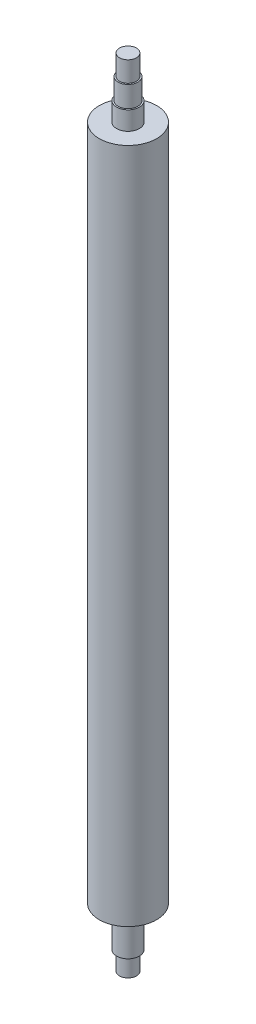
ISO-10303-21;
HEADER;
FILE_DESCRIPTION(('STEP AP214'),'2;1');
FILE_NAME('part.step','',(''),(''),'','','');
FILE_SCHEMA(('AUTOMOTIVE_DESIGN { 1 0 10303 214 1 1 1 1 }'));
ENDSEC;
DATA;
#1=APPLICATION_CONTEXT('core data for automotive mechanical design processes');
#2=APPLICATION_PROTOCOL_DEFINITION('international standard','automotive_design',2000,#1);
#3=PRODUCT_CONTEXT('',#1,'mechanical');
#4=PRODUCT('Part','Part','',(#3));
#5=PRODUCT_RELATED_PRODUCT_CATEGORY('part','',(#4));
#6=PRODUCT_DEFINITION_FORMATION('','',#4);
#7=PRODUCT_DEFINITION_CONTEXT('part definition',#1,'design');
#8=PRODUCT_DEFINITION('design','',#6,#7);
#9=PRODUCT_DEFINITION_SHAPE('','',#8);
#10=(LENGTH_UNIT() NAMED_UNIT(*) SI_UNIT(.MILLI.,.METRE.));
#11=(NAMED_UNIT(*) PLANE_ANGLE_UNIT() SI_UNIT($,.RADIAN.));
#12=(NAMED_UNIT(*) SI_UNIT($,.STERADIAN.) SOLID_ANGLE_UNIT());
#13=UNCERTAINTY_MEASURE_WITH_UNIT(LENGTH_MEASURE(1.E-05),#10,'distance_accuracy_value','');
#14=(GEOMETRIC_REPRESENTATION_CONTEXT(3) GLOBAL_UNCERTAINTY_ASSIGNED_CONTEXT((#13)) GLOBAL_UNIT_ASSIGNED_CONTEXT((#10,
#11,#12)) REPRESENTATION_CONTEXT('',''));
#15=CARTESIAN_POINT('',(0.,0.,0.));
#16=DIRECTION('',(0.,0.,1.));
#17=DIRECTION('',(1.,0.,0.));
#18=AXIS2_PLACEMENT_3D('',#15,#16,#17);
#19=CARTESIAN_POINT('',(0.,236.,0.));
#20=DIRECTION('',(0.,-1.,0.));
#21=DIRECTION('',(0.,0.,-1.));
#22=AXIS2_PLACEMENT_3D('',#19,#20,#21);
#23=CYLINDRICAL_SURFACE('',#22,10.);
#24=CARTESIAN_POINT('',(0.,236.,0.));
#25=DIRECTION('',(0.,1.,0.));
#26=DIRECTION('',(0.,0.,1.));
#27=AXIS2_PLACEMENT_3D('',#24,#25,#26);
#28=CIRCLE('',#27,10.);
#29=CARTESIAN_POINT('',(0.,236.,10.));
#30=VERTEX_POINT('',#29);
#31=EDGE_CURVE('E57',#30,#30,#28,.T.);
#32=ORIENTED_EDGE('',*,*,#31,.F.);
#33=EDGE_LOOP('',(#32));
#34=FACE_BOUND('',#33,.T.);
#35=CARTESIAN_POINT('',(0.,0.,0.));
#36=DIRECTION('',(0.,1.,0.));
#37=DIRECTION('',(0.,0.,1.));
#38=AXIS2_PLACEMENT_3D('',#35,#36,#37);
#39=CIRCLE('',#38,10.);
#40=CARTESIAN_POINT('',(0.,0.,10.));
#41=VERTEX_POINT('',#40);
#42=EDGE_CURVE('E34',#41,#41,#39,.T.);
#43=ORIENTED_EDGE('',*,*,#42,.T.);
#44=EDGE_LOOP('',(#43));
#45=FACE_BOUND('',#44,.T.);
#46=ADVANCED_FACE('F31',(#34,#45),#23,.T.);
#47=CARTESIAN_POINT('',(0.,236.,0.));
#48=DIRECTION('',(0.,1.,0.));
#49=DIRECTION('',(0.,0.,1.));
#50=AXIS2_PLACEMENT_3D('',#47,#48,#49);
#51=PLANE('',#50);
#52=CARTESIAN_POINT('',(0.,236.,0.));
#53=DIRECTION('',(0.,1.,0.));
#54=DIRECTION('',(0.,0.,1.));
#55=AXIS2_PLACEMENT_3D('',#52,#53,#54);
#56=CIRCLE('',#55,3.965);
#57=CARTESIAN_POINT('',(0.,236.,-3.965));
#58=VERTEX_POINT('',#57);
#59=EDGE_CURVE('E43',#58,#58,#56,.T.);
#60=ORIENTED_EDGE('',*,*,#59,.F.);
#61=EDGE_LOOP('',(#60));
#62=FACE_BOUND('',#61,.T.);
#63=ORIENTED_EDGE('',*,*,#31,.T.);
#64=EDGE_LOOP('',(#63));
#65=FACE_BOUND('',#64,.T.);
#66=ADVANCED_FACE('F78',(#62,#65),#51,.T.);
#67=CARTESIAN_POINT('',(0.,0.,0.));
#68=DIRECTION('',(0.,1.,0.));
#69=DIRECTION('',(0.,0.,1.));
#70=AXIS2_PLACEMENT_3D('',#67,#68,#69);
#71=PLANE('',#70);
#72=CARTESIAN_POINT('',(0.,0.,0.));
#73=DIRECTION('',(0.,1.,0.));
#74=DIRECTION('',(0.,0.,1.));
#75=AXIS2_PLACEMENT_3D('',#72,#73,#74);
#76=CIRCLE('',#75,3.965);
#77=CARTESIAN_POINT('',(0.,0.,3.965));
#78=VERTEX_POINT('',#77);
#79=EDGE_CURVE('E61',#78,#78,#76,.T.);
#80=ORIENTED_EDGE('',*,*,#79,.T.);
#81=EDGE_LOOP('',(#80));
#82=FACE_BOUND('',#81,.T.);
#83=ORIENTED_EDGE('',*,*,#42,.F.);
#84=EDGE_LOOP('',(#83));
#85=FACE_BOUND('',#84,.T.);
#86=ADVANCED_FACE('F75',(#82,#85),#71,.F.);
#87=CARTESIAN_POINT('',(0.,-14.,0.));
#88=DIRECTION('',(0.,1.,0.));
#89=DIRECTION('',(0.,0.,1.));
#90=AXIS2_PLACEMENT_3D('',#87,#88,#89);
#91=CYLINDRICAL_SURFACE('',#90,3.965);
#92=CARTESIAN_POINT('',(0.,-14.,0.));
#93=DIRECTION('',(0.,1.,0.));
#94=DIRECTION('',(0.,0.,1.));
#95=AXIS2_PLACEMENT_3D('',#92,#93,#94);
#96=CIRCLE('',#95,3.965);
#97=CARTESIAN_POINT('',(0.,-14.,3.965));
#98=VERTEX_POINT('',#97);
#99=EDGE_CURVE('E64',#98,#98,#96,.T.);
#100=ORIENTED_EDGE('',*,*,#99,.T.);
#101=EDGE_LOOP('',(#100));
#102=FACE_BOUND('',#101,.T.);
#103=ORIENTED_EDGE('',*,*,#79,.F.);
#104=EDGE_LOOP('',(#103));
#105=FACE_BOUND('',#104,.T.);
#106=ADVANCED_FACE('F77',(#102,#105),#91,.T.);
#107=CARTESIAN_POINT('',(0.,-14.,0.));
#108=DIRECTION('',(0.,1.,0.));
#109=DIRECTION('',(0.,0.,1.));
#110=AXIS2_PLACEMENT_3D('',#107,#108,#109);
#111=PLANE('',#110);
#112=CARTESIAN_POINT('',(0.,-14.,0.));
#113=DIRECTION('',(0.,1.,0.));
#114=DIRECTION('',(0.,0.,1.));
#115=AXIS2_PLACEMENT_3D('',#112,#113,#114);
#116=CIRCLE('',#115,2.95);
#117=CARTESIAN_POINT('',(0.,-14.,2.95));
#118=VERTEX_POINT('',#117);
#119=EDGE_CURVE('E54',#118,#118,#116,.T.);
#120=ORIENTED_EDGE('',*,*,#119,.T.);
#121=EDGE_LOOP('',(#120));
#122=FACE_BOUND('',#121,.T.);
#123=ORIENTED_EDGE('',*,*,#99,.F.);
#124=EDGE_LOOP('',(#123));
#125=FACE_BOUND('',#124,.T.);
#126=ADVANCED_FACE('F84',(#122,#125),#111,.F.);
#127=CARTESIAN_POINT('',(0.,-20.5,0.));
#128=DIRECTION('',(0.,1.,0.));
#129=DIRECTION('',(0.,0.,1.));
#130=AXIS2_PLACEMENT_3D('',#127,#128,#129);
#131=CYLINDRICAL_SURFACE('',#130,2.95);
#132=CARTESIAN_POINT('',(0.,-20.5,0.));
#133=DIRECTION('',(0.,1.,0.));
#134=DIRECTION('',(0.,0.,1.));
#135=AXIS2_PLACEMENT_3D('',#132,#133,#134);
#136=CIRCLE('',#135,2.95);
#137=CARTESIAN_POINT('',(0.,-20.5,2.95));
#138=VERTEX_POINT('',#137);
#139=EDGE_CURVE('E58',#138,#138,#136,.T.);
#140=CARTESIAN_POINT('',(0.,-20.5,2.95));
#141=CARTESIAN_POINT('',(0.,-20.4322916666667,2.95));
#142=CARTESIAN_POINT('',(0.,-20.3645833333333,2.95));
#143=CARTESIAN_POINT('',(0.,-20.2291666666667,2.95));
#144=CARTESIAN_POINT('',(0.,-20.1614583333333,2.95));
#145=CARTESIAN_POINT('',(0.,-20.0260416666667,2.95));
#146=CARTESIAN_POINT('',(0.,-19.9583333333333,2.95));
#147=CARTESIAN_POINT('',(0.,-19.8229166666667,2.95));
#148=CARTESIAN_POINT('',(0.,-19.7552083333333,2.95));
#149=CARTESIAN_POINT('',(0.,-19.6197916666667,2.95));
#150=CARTESIAN_POINT('',(0.,-19.5520833333333,2.95));
#151=CARTESIAN_POINT('',(0.,-19.4166666666667,2.95));
#152=CARTESIAN_POINT('',(0.,-19.3489583333333,2.95));
#153=CARTESIAN_POINT('',(0.,-19.2135416666667,2.95));
#154=CARTESIAN_POINT('',(0.,-19.1458333333333,2.95));
#155=CARTESIAN_POINT('',(0.,-19.0104166666667,2.95));
#156=CARTESIAN_POINT('',(0.,-18.9427083333333,2.95));
#157=CARTESIAN_POINT('',(0.,-18.8072916666667,2.95));
#158=CARTESIAN_POINT('',(0.,-18.7395833333333,2.95));
#159=CARTESIAN_POINT('',(0.,-18.6041666666667,2.95));
#160=CARTESIAN_POINT('',(0.,-18.5364583333333,2.95));
#161=CARTESIAN_POINT('',(0.,-18.4010416666667,2.95));
#162=CARTESIAN_POINT('',(0.,-18.3333333333333,2.95));
#163=CARTESIAN_POINT('',(0.,-18.1979166666667,2.95));
#164=CARTESIAN_POINT('',(0.,-18.1302083333333,2.95));
#165=CARTESIAN_POINT('',(0.,-17.9947916666667,2.95));
#166=CARTESIAN_POINT('',(0.,-17.9270833333333,2.95));
#167=CARTESIAN_POINT('',(0.,-17.7916666666667,2.95));
#168=CARTESIAN_POINT('',(0.,-17.7239583333333,2.95));
#169=CARTESIAN_POINT('',(0.,-17.5885416666667,2.95));
#170=CARTESIAN_POINT('',(0.,-17.5208333333333,2.95));
#171=CARTESIAN_POINT('',(0.,-17.3854166666667,2.95));
#172=CARTESIAN_POINT('',(0.,-17.3177083333333,2.95));
#173=CARTESIAN_POINT('',(0.,-17.1822916666667,2.95));
#174=CARTESIAN_POINT('',(0.,-17.1145833333333,2.95));
#175=CARTESIAN_POINT('',(0.,-16.9791666666667,2.95));
#176=CARTESIAN_POINT('',(0.,-16.9114583333333,2.95));
#177=CARTESIAN_POINT('',(0.,-16.7760416666667,2.95));
#178=CARTESIAN_POINT('',(0.,-16.7083333333333,2.95));
#179=CARTESIAN_POINT('',(0.,-16.5729166666667,2.95));
#180=CARTESIAN_POINT('',(0.,-16.5052083333333,2.95));
#181=CARTESIAN_POINT('',(0.,-16.3697916666667,2.95));
#182=CARTESIAN_POINT('',(0.,-16.3020833333333,2.95));
#183=CARTESIAN_POINT('',(0.,-16.1666666666667,2.95));
#184=CARTESIAN_POINT('',(0.,-16.0989583333333,2.95));
#185=CARTESIAN_POINT('',(0.,-15.9635416666667,2.95));
#186=CARTESIAN_POINT('',(0.,-15.8958333333333,2.95));
#187=CARTESIAN_POINT('',(0.,-15.7604166666667,2.95));
#188=CARTESIAN_POINT('',(0.,-15.6927083333333,2.95));
#189=CARTESIAN_POINT('',(0.,-15.5572916666667,2.95));
#190=CARTESIAN_POINT('',(0.,-15.4895833333333,2.95));
#191=CARTESIAN_POINT('',(0.,-15.3541666666667,2.95));
#192=CARTESIAN_POINT('',(0.,-15.2864583333333,2.95));
#193=CARTESIAN_POINT('',(0.,-15.1510416666667,2.95));
#194=CARTESIAN_POINT('',(0.,-15.0833333333333,2.95));
#195=CARTESIAN_POINT('',(0.,-14.9479166666667,2.95));
#196=CARTESIAN_POINT('',(0.,-14.8802083333333,2.95));
#197=CARTESIAN_POINT('',(0.,-14.7447916666667,2.95));
#198=CARTESIAN_POINT('',(0.,-14.6770833333333,2.95));
#199=CARTESIAN_POINT('',(0.,-14.5416666666667,2.95));
#200=CARTESIAN_POINT('',(0.,-14.4739583333333,2.95));
#201=CARTESIAN_POINT('',(0.,-14.3385416666667,2.95));
#202=CARTESIAN_POINT('',(0.,-14.2708333333333,2.95));
#203=CARTESIAN_POINT('',(0.,-14.1354166666667,2.95));
#204=CARTESIAN_POINT('',(0.,-14.0677083333333,2.95));
#205=CARTESIAN_POINT('',(0.,-14.,2.95));
#206=B_SPLINE_CURVE_WITH_KNOTS('',3,(#140,#141,#142,#143,#144,#145,#146,#147,#148,#149,#150,
#151,#152,#153,#154,#155,#156,#157,#158,#159,#160,#161,#162,#163,#164,#165,#166,#167,#168,#169,
#170,#171,#172,#173,#174,#175,#176,#177,#178,#179,#180,#181,#182,#183,#184,#185,#186,#187,#188,
#189,#190,#191,#192,#193,#194,#195,#196,#197,#198,#199,#200,#201,#202,#203,#204,#205),
.UNSPECIFIED.,.F.,.F.,(4,2,2,2,2,2,2,2,2,2,2,2,2,2,2,2,2,2,2,2,2,2,2,2,2,2,2,2,2,2,2,2,4),(0.,
0.203125000000002,0.40625,0.609375000000002,0.812500000000001,1.015625,1.21875,1.421875,1.625,
1.828125,2.03125,2.234375,2.4375,2.640625,2.84375,3.046875,3.25,3.453125,3.65625,3.859375,
4.0625,4.265625,4.46875,4.671875,4.875,5.078125,5.28125,5.484375,5.6875,5.890625,6.09375,
6.296875,6.5),.UNSPECIFIED.);
#207=EDGE_CURVE('BSEAM171',#138,#118,#206,.T.);
#208=ORIENTED_EDGE('',*,*,#139,.T.);
#209=ORIENTED_EDGE('',*,*,#119,.F.);
#210=ORIENTED_EDGE('',*,*,#207,.T.);
#211=ORIENTED_EDGE('',*,*,#207,.F.);
#212=EDGE_LOOP('',(#208,#210,#209,#211));
#213=FACE_BOUND('',#212,.T.);
#214=ADVANCED_FACE('F171',(#213),#131,.T.);
#215=CARTESIAN_POINT('',(0.,-20.5,0.));
#216=DIRECTION('',(0.,1.,0.));
#217=DIRECTION('',(0.,0.,1.));
#218=AXIS2_PLACEMENT_3D('',#215,#216,#217);
#219=PLANE('',#218);
#220=ORIENTED_EDGE('',*,*,#139,.F.);
#221=EDGE_LOOP('',(#220));
#222=FACE_BOUND('',#221,.T.);
#223=ADVANCED_FACE('F104',(#222),#219,.F.);
#224=CARTESIAN_POINT('',(0.,242.5,0.));
#225=DIRECTION('',(0.,-1.,0.));
#226=DIRECTION('',(0.,0.,-1.));
#227=AXIS2_PLACEMENT_3D('',#224,#225,#226);
#228=CYLINDRICAL_SURFACE('',#227,3.965);
#229=CARTESIAN_POINT('',(0.,242.5,0.));
#230=DIRECTION('',(0.,1.,0.));
#231=DIRECTION('',(0.,0.,1.));
#232=AXIS2_PLACEMENT_3D('',#229,#230,#231);
#233=CIRCLE('',#232,3.965);
#234=CARTESIAN_POINT('',(0.,242.5,-3.965));
#235=VERTEX_POINT('',#234);
#236=EDGE_CURVE('E50',#235,#235,#233,.T.);
#237=CARTESIAN_POINT('',(0.,242.5,-3.965));
#238=CARTESIAN_POINT('',(0.,242.432291666667,-3.965));
#239=CARTESIAN_POINT('',(0.,242.364583333333,-3.965));
#240=CARTESIAN_POINT('',(0.,242.229166666667,-3.965));
#241=CARTESIAN_POINT('',(0.,242.161458333333,-3.965));
#242=CARTESIAN_POINT('',(0.,242.026041666667,-3.965));
#243=CARTESIAN_POINT('',(0.,241.958333333333,-3.965));
#244=CARTESIAN_POINT('',(0.,241.822916666667,-3.965));
#245=CARTESIAN_POINT('',(0.,241.755208333333,-3.965));
#246=CARTESIAN_POINT('',(0.,241.619791666667,-3.965));
#247=CARTESIAN_POINT('',(0.,241.552083333333,-3.965));
#248=CARTESIAN_POINT('',(0.,241.416666666667,-3.965));
#249=CARTESIAN_POINT('',(0.,241.348958333333,-3.965));
#250=CARTESIAN_POINT('',(0.,241.213541666667,-3.965));
#251=CARTESIAN_POINT('',(0.,241.145833333333,-3.965));
#252=CARTESIAN_POINT('',(0.,241.010416666667,-3.965));
#253=CARTESIAN_POINT('',(0.,240.942708333333,-3.965));
#254=CARTESIAN_POINT('',(0.,240.807291666667,-3.965));
#255=CARTESIAN_POINT('',(0.,240.739583333333,-3.965));
#256=CARTESIAN_POINT('',(0.,240.604166666667,-3.965));
#257=CARTESIAN_POINT('',(0.,240.536458333333,-3.965));
#258=CARTESIAN_POINT('',(0.,240.401041666667,-3.965));
#259=CARTESIAN_POINT('',(0.,240.333333333333,-3.965));
#260=CARTESIAN_POINT('',(0.,240.197916666667,-3.965));
#261=CARTESIAN_POINT('',(0.,240.130208333333,-3.965));
#262=CARTESIAN_POINT('',(0.,239.994791666667,-3.965));
#263=CARTESIAN_POINT('',(0.,239.927083333333,-3.965));
#264=CARTESIAN_POINT('',(0.,239.791666666667,-3.965));
#265=CARTESIAN_POINT('',(0.,239.723958333333,-3.965));
#266=CARTESIAN_POINT('',(0.,239.588541666667,-3.965));
#267=CARTESIAN_POINT('',(0.,239.520833333333,-3.965));
#268=CARTESIAN_POINT('',(0.,239.385416666667,-3.965));
#269=CARTESIAN_POINT('',(0.,239.317708333333,-3.965));
#270=CARTESIAN_POINT('',(0.,239.182291666667,-3.965));
#271=CARTESIAN_POINT('',(0.,239.114583333333,-3.965));
#272=CARTESIAN_POINT('',(0.,238.979166666667,-3.965));
#273=CARTESIAN_POINT('',(0.,238.911458333333,-3.965));
#274=CARTESIAN_POINT('',(0.,238.776041666667,-3.965));
#275=CARTESIAN_POINT('',(0.,238.708333333333,-3.965));
#276=CARTESIAN_POINT('',(0.,238.572916666667,-3.965));
#277=CARTESIAN_POINT('',(0.,238.505208333333,-3.965));
#278=CARTESIAN_POINT('',(0.,238.369791666667,-3.965));
#279=CARTESIAN_POINT('',(0.,238.302083333333,-3.965));
#280=CARTESIAN_POINT('',(0.,238.166666666667,-3.965));
#281=CARTESIAN_POINT('',(0.,238.098958333333,-3.965));
#282=CARTESIAN_POINT('',(0.,237.963541666667,-3.965));
#283=CARTESIAN_POINT('',(0.,237.895833333333,-3.965));
#284=CARTESIAN_POINT('',(0.,237.760416666667,-3.965));
#285=CARTESIAN_POINT('',(0.,237.692708333333,-3.965));
#286=CARTESIAN_POINT('',(0.,237.557291666667,-3.965));
#287=CARTESIAN_POINT('',(0.,237.489583333333,-3.965));
#288=CARTESIAN_POINT('',(0.,237.354166666667,-3.965));
#289=CARTESIAN_POINT('',(0.,237.286458333333,-3.965));
#290=CARTESIAN_POINT('',(0.,237.151041666667,-3.965));
#291=CARTESIAN_POINT('',(0.,237.083333333333,-3.965));
#292=CARTESIAN_POINT('',(0.,236.947916666667,-3.965));
#293=CARTESIAN_POINT('',(0.,236.880208333333,-3.965));
#294=CARTESIAN_POINT('',(0.,236.744791666667,-3.965));
#295=CARTESIAN_POINT('',(0.,236.677083333333,-3.965));
#296=CARTESIAN_POINT('',(0.,236.541666666667,-3.965));
#297=CARTESIAN_POINT('',(0.,236.473958333333,-3.965));
#298=CARTESIAN_POINT('',(0.,236.338541666667,-3.965));
#299=CARTESIAN_POINT('',(0.,236.270833333333,-3.965));
#300=CARTESIAN_POINT('',(0.,236.135416666667,-3.965));
#301=CARTESIAN_POINT('',(0.,236.067708333333,-3.965));
#302=CARTESIAN_POINT('',(0.,236.,-3.965));
#303=B_SPLINE_CURVE_WITH_KNOTS('',3,(#237,#238,#239,#240,#241,#242,#243,#244,#245,#246,#247,
#248,#249,#250,#251,#252,#253,#254,#255,#256,#257,#258,#259,#260,#261,#262,#263,#264,#265,#266,
#267,#268,#269,#270,#271,#272,#273,#274,#275,#276,#277,#278,#279,#280,#281,#282,#283,#284,#285,
#286,#287,#288,#289,#290,#291,#292,#293,#294,#295,#296,#297,#298,#299,#300,#301,#302),
.UNSPECIFIED.,.F.,.F.,(4,2,2,2,2,2,2,2,2,2,2,2,2,2,2,2,2,2,2,2,2,2,2,2,2,2,2,2,2,2,2,2,4),(0.,
0.203125000000026,0.406250000000025,0.609375000000023,0.812500000000022,1.01562500000002,
1.21875000000002,1.42187500000002,1.62500000000002,1.82812500000001,2.03125000000001,
2.23437500000001,2.43750000000001,2.64062500000001,2.84375000000001,3.046875,3.25000000000003,
3.45312500000003,3.65625000000003,3.85937500000003,4.06250000000002,4.26562500000002,
4.46875000000002,4.67187500000002,4.87500000000002,5.07812500000002,5.28125000000002,
5.48437500000001,5.68750000000001,5.89062500000001,6.09375000000001,6.29687500000001,
6.50000000000003),.UNSPECIFIED.);
#304=EDGE_CURVE('BSEAM109',#235,#58,#303,.T.);
#305=ORIENTED_EDGE('',*,*,#236,.F.);
#306=ORIENTED_EDGE('',*,*,#59,.T.);
#307=ORIENTED_EDGE('',*,*,#304,.T.);
#308=ORIENTED_EDGE('',*,*,#304,.F.);
#309=EDGE_LOOP('',(#305,#307,#306,#308));
#310=FACE_BOUND('',#309,.T.);
#311=ADVANCED_FACE('F109',(#310),#228,.T.);
#312=CARTESIAN_POINT('',(0.,242.5,0.));
#313=DIRECTION('',(0.,1.,0.));
#314=DIRECTION('',(0.,0.,1.));
#315=AXIS2_PLACEMENT_3D('',#312,#313,#314);
#316=PLANE('',#315);
#317=CARTESIAN_POINT('',(0.,242.5,0.));
#318=DIRECTION('',(0.,1.,0.));
#319=DIRECTION('',(0.,0.,1.));
#320=AXIS2_PLACEMENT_3D('',#317,#318,#319);
#321=CIRCLE('',#320,3.45);
#322=CARTESIAN_POINT('',(0.,242.5,3.45));
#323=VERTEX_POINT('',#322);
#324=EDGE_CURVE('E38',#323,#323,#321,.T.);
#325=ORIENTED_EDGE('',*,*,#324,.F.);
#326=EDGE_LOOP('',(#325));
#327=FACE_BOUND('',#326,.T.);
#328=ORIENTED_EDGE('',*,*,#236,.T.);
#329=EDGE_LOOP('',(#328));
#330=FACE_BOUND('',#329,.T.);
#331=ADVANCED_FACE('F114',(#327,#330),#316,.T.);
#332=CARTESIAN_POINT('',(0.,249.8,0.));
#333=DIRECTION('',(0.,-1.,0.));
#334=DIRECTION('',(0.,0.,-1.));
#335=AXIS2_PLACEMENT_3D('',#332,#333,#334);
#336=CYLINDRICAL_SURFACE('',#335,3.45);
#337=CARTESIAN_POINT('',(0.,249.8,0.));
#338=DIRECTION('',(0.,1.,0.));
#339=DIRECTION('',(0.,0.,1.));
#340=AXIS2_PLACEMENT_3D('',#337,#338,#339);
#341=CIRCLE('',#340,3.45);
#342=CARTESIAN_POINT('',(0.,249.8,3.45));
#343=VERTEX_POINT('',#342);
#344=EDGE_CURVE('E48',#343,#343,#341,.T.);
#345=ORIENTED_EDGE('',*,*,#344,.F.);
#346=EDGE_LOOP('',(#345));
#347=FACE_BOUND('',#346,.T.);
#348=ORIENTED_EDGE('',*,*,#324,.T.);
#349=EDGE_LOOP('',(#348));
#350=FACE_BOUND('',#349,.T.);
#351=ADVANCED_FACE('F124',(#347,#350),#336,.T.);
#352=CARTESIAN_POINT('',(0.,249.8,0.));
#353=DIRECTION('',(0.,1.,0.));
#354=DIRECTION('',(0.,0.,1.));
#355=AXIS2_PLACEMENT_3D('',#352,#353,#354);
#356=PLANE('',#355);
#357=CARTESIAN_POINT('',(0.,249.8,0.));
#358=DIRECTION('',(0.,1.,0.));
#359=DIRECTION('',(0.,0.,1.));
#360=AXIS2_PLACEMENT_3D('',#357,#358,#359);
#361=CIRCLE('',#360,2.95);
#362=CARTESIAN_POINT('',(0.,249.8,2.95));
#363=VERTEX_POINT('',#362);
#364=EDGE_CURVE('E10',#363,#363,#361,.T.);
#365=ORIENTED_EDGE('',*,*,#364,.F.);
#366=EDGE_LOOP('',(#365));
#367=FACE_BOUND('',#366,.T.);
#368=ORIENTED_EDGE('',*,*,#344,.T.);
#369=EDGE_LOOP('',(#368));
#370=FACE_BOUND('',#369,.T.);
#371=ADVANCED_FACE('F134',(#367,#370),#356,.T.);
#372=CARTESIAN_POINT('',(0.,256.9,0.));
#373=DIRECTION('',(0.,-1.,0.));
#374=DIRECTION('',(0.,0.,-1.));
#375=AXIS2_PLACEMENT_3D('',#372,#373,#374);
#376=CYLINDRICAL_SURFACE('',#375,2.95);
#377=CARTESIAN_POINT('',(0.,256.9,0.));
#378=DIRECTION('',(0.,1.,0.));
#379=DIRECTION('',(0.,0.,1.));
#380=AXIS2_PLACEMENT_3D('',#377,#378,#379);
#381=CIRCLE('',#380,2.95);
#382=CARTESIAN_POINT('',(0.,256.9,2.95));
#383=VERTEX_POINT('',#382);
#384=EDGE_CURVE('E47',#383,#383,#381,.T.);
#385=ORIENTED_EDGE('',*,*,#384,.F.);
#386=EDGE_LOOP('',(#385));
#387=FACE_BOUND('',#386,.T.);
#388=ORIENTED_EDGE('',*,*,#364,.T.);
#389=EDGE_LOOP('',(#388));
#390=FACE_BOUND('',#389,.T.);
#391=ADVANCED_FACE('F144',(#387,#390),#376,.T.);
#392=CARTESIAN_POINT('',(0.,256.9,0.));
#393=DIRECTION('',(0.,1.,0.));
#394=DIRECTION('',(0.,0.,1.));
#395=AXIS2_PLACEMENT_3D('',#392,#393,#394);
#396=PLANE('',#395);
#397=ORIENTED_EDGE('',*,*,#384,.T.);
#398=EDGE_LOOP('',(#397));
#399=FACE_BOUND('',#398,.T.);
#400=ADVANCED_FACE('F154',(#399),#396,.T.);
#401=CLOSED_SHELL('',(#46,#66,#86,#106,#126,#214,#223,#311,#331,#351,#371,#391,#400));
#402=MANIFOLD_SOLID_BREP('B2',#401);
#403=ADVANCED_BREP_SHAPE_REPRESENTATION('',(#18,#402),#14);
#404=SHAPE_DEFINITION_REPRESENTATION(#9,#403);
ENDSEC;
END-ISO-10303-21;
